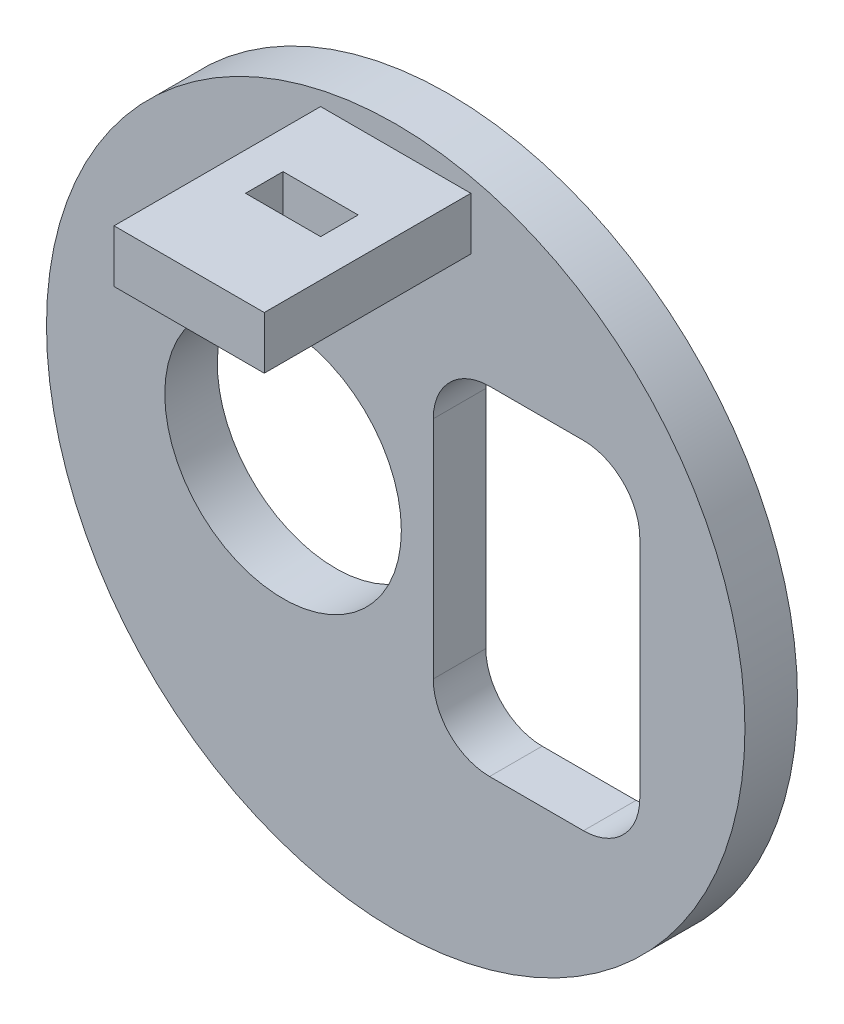
ISO-10303-21;
HEADER;
FILE_DESCRIPTION(('STEP AP214'),'2;1');
FILE_NAME('part.step','',(''),(''),'','','');
FILE_SCHEMA(('AUTOMOTIVE_DESIGN { 1 0 10303 214 1 1 1 1 }'));
ENDSEC;
DATA;
#1=APPLICATION_CONTEXT('core data for automotive mechanical design processes');
#2=APPLICATION_PROTOCOL_DEFINITION('international standard','automotive_design',2000,#1);
#3=PRODUCT_CONTEXT('',#1,'mechanical');
#4=PRODUCT('Part','Part','',(#3));
#5=PRODUCT_RELATED_PRODUCT_CATEGORY('part','',(#4));
#6=PRODUCT_DEFINITION_FORMATION('','',#4);
#7=PRODUCT_DEFINITION_CONTEXT('part definition',#1,'design');
#8=PRODUCT_DEFINITION('design','',#6,#7);
#9=PRODUCT_DEFINITION_SHAPE('','',#8);
#10=(LENGTH_UNIT() NAMED_UNIT(*) SI_UNIT(.MILLI.,.METRE.));
#11=(NAMED_UNIT(*) PLANE_ANGLE_UNIT() SI_UNIT($,.RADIAN.));
#12=(NAMED_UNIT(*) SI_UNIT($,.STERADIAN.) SOLID_ANGLE_UNIT());
#13=UNCERTAINTY_MEASURE_WITH_UNIT(LENGTH_MEASURE(1.E-05),#10,'distance_accuracy_value','');
#14=(GEOMETRIC_REPRESENTATION_CONTEXT(3) GLOBAL_UNCERTAINTY_ASSIGNED_CONTEXT((#13)) GLOBAL_UNIT_ASSIGNED_CONTEXT((#10,
#11,#12)) REPRESENTATION_CONTEXT('',''));
#15=CARTESIAN_POINT('',(0.,0.,0.));
#16=DIRECTION('',(0.,0.,1.));
#17=DIRECTION('',(1.,0.,0.));
#18=AXIS2_PLACEMENT_3D('',#15,#16,#17);
#19=CARTESIAN_POINT('',(48.,0.,64.6));
#20=DIRECTION('',(0.,0.,-1.));
#21=DIRECTION('',(-1.,0.,0.));
#22=AXIS2_PLACEMENT_3D('',#19,#20,#21);
#23=CYLINDRICAL_SURFACE('',#22,18.6);
#24=CARTESIAN_POINT('',(48.,0.,64.6));
#25=DIRECTION('',(0.,0.,1.));
#26=DIRECTION('',(1.,0.,0.));
#27=AXIS2_PLACEMENT_3D('',#24,#25,#26);
#28=CIRCLE('',#27,18.6);
#29=CARTESIAN_POINT('',(66.6,0.,64.6));
#30=VERTEX_POINT('',#29);
#31=EDGE_CURVE('E198',#30,#30,#28,.T.);
#32=ORIENTED_EDGE('',*,*,#31,.F.);
#33=EDGE_LOOP('',(#32));
#34=FACE_BOUND('',#33,.T.);
#35=CARTESIAN_POINT('',(48.,0.,61.8));
#36=DIRECTION('',(0.,0.,1.));
#37=DIRECTION('',(1.,0.,0.));
#38=AXIS2_PLACEMENT_3D('',#35,#36,#37);
#39=CIRCLE('',#38,18.6);
#40=CARTESIAN_POINT('',(66.6,0.,61.8));
#41=VERTEX_POINT('',#40);
#42=EDGE_CURVE('E289',#41,#41,#39,.T.);
#43=ORIENTED_EDGE('',*,*,#42,.T.);
#44=EDGE_LOOP('',(#43));
#45=FACE_BOUND('',#44,.T.);
#46=ADVANCED_FACE('F43',(#34,#45),#23,.T.);
#47=CARTESIAN_POINT('',(48.,0.,64.6));
#48=DIRECTION('',(0.,0.,1.));
#49=DIRECTION('',(1.,0.,0.));
#50=AXIS2_PLACEMENT_3D('',#47,#48,#49);
#51=PLANE('',#50);
#52=CARTESIAN_POINT('',(53.,-6.,64.6));
#53=DIRECTION('',(0.,0.,1.));
#54=DIRECTION('',(1.,0.,0.));
#55=AXIS2_PLACEMENT_3D('',#52,#53,#54);
#56=CIRCLE('',#55,3.);
#57=CARTESIAN_POINT('',(50.,-6.,64.6));
#58=VERTEX_POINT('',#57);
#59=CARTESIAN_POINT('',(53.,-9.,64.6));
#60=VERTEX_POINT('',#59);
#61=EDGE_CURVE('E294',#58,#60,#56,.T.);
#62=ORIENTED_EDGE('',*,*,#61,.F.);
#63=DIRECTION('',(0.,-1.,0.));
#64=VECTOR('',#63,1.);
#65=CARTESIAN_POINT('',(50.,0.,64.6));
#66=LINE('',#65,#64);
#67=CARTESIAN_POINT('',(50.,6.,64.6));
#68=VERTEX_POINT('',#67);
#69=EDGE_CURVE('E300',#68,#58,#66,.T.);
#70=ORIENTED_EDGE('',*,*,#69,.F.);
#71=CARTESIAN_POINT('',(53.,6.,64.6));
#72=DIRECTION('',(0.,0.,1.));
#73=DIRECTION('',(1.,0.,0.));
#74=AXIS2_PLACEMENT_3D('',#71,#72,#73);
#75=CIRCLE('',#74,3.);
#76=CARTESIAN_POINT('',(53.,9.,64.6));
#77=VERTEX_POINT('',#76);
#78=EDGE_CURVE('E305',#77,#68,#75,.T.);
#79=ORIENTED_EDGE('',*,*,#78,.F.);
#80=DIRECTION('',(-1.,0.,0.));
#81=VECTOR('',#80,1.);
#82=CARTESIAN_POINT('',(48.,9.,64.6));
#83=LINE('',#82,#81);
#84=CARTESIAN_POINT('',(58.,9.,64.6));
#85=VERTEX_POINT('',#84);
#86=EDGE_CURVE('E307',#85,#77,#83,.T.);
#87=ORIENTED_EDGE('',*,*,#86,.F.);
#88=CARTESIAN_POINT('',(58.,6.,64.6));
#89=DIRECTION('',(0.,0.,1.));
#90=DIRECTION('',(1.,0.,0.));
#91=AXIS2_PLACEMENT_3D('',#88,#89,#90);
#92=CIRCLE('',#91,3.);
#93=CARTESIAN_POINT('',(61.,6.,64.6));
#94=VERTEX_POINT('',#93);
#95=EDGE_CURVE('E310',#94,#85,#92,.T.);
#96=ORIENTED_EDGE('',*,*,#95,.F.);
#97=DIRECTION('',(0.,1.,0.));
#98=VECTOR('',#97,1.);
#99=CARTESIAN_POINT('',(61.,0.,64.6));
#100=LINE('',#99,#98);
#101=CARTESIAN_POINT('',(61.,-6.,64.6));
#102=VERTEX_POINT('',#101);
#103=EDGE_CURVE('E313',#102,#94,#100,.T.);
#104=ORIENTED_EDGE('',*,*,#103,.F.);
#105=CARTESIAN_POINT('',(58.,-6.,64.6));
#106=DIRECTION('',(0.,0.,1.));
#107=DIRECTION('',(1.,0.,0.));
#108=AXIS2_PLACEMENT_3D('',#105,#106,#107);
#109=CIRCLE('',#108,3.);
#110=CARTESIAN_POINT('',(58.,-9.,64.6));
#111=VERTEX_POINT('',#110);
#112=EDGE_CURVE('E311',#111,#102,#109,.T.);
#113=ORIENTED_EDGE('',*,*,#112,.F.);
#114=DIRECTION('',(1.,0.,0.));
#115=VECTOR('',#114,1.);
#116=CARTESIAN_POINT('',(48.,-9.,64.6));
#117=LINE('',#116,#115);
#118=EDGE_CURVE('E312',#60,#111,#117,.T.);
#119=ORIENTED_EDGE('',*,*,#118,.F.);
#120=EDGE_LOOP('',(#62,#70,#79,#87,#96,#104,#113,#119));
#121=FACE_BOUND('',#120,.T.);
#122=CARTESIAN_POINT('',(42.,0.,64.6));
#123=DIRECTION('',(0.,0.,1.));
#124=DIRECTION('',(1.,0.,0.));
#125=AXIS2_PLACEMENT_3D('',#122,#123,#124);
#126=CIRCLE('',#125,6.3);
#127=CARTESIAN_POINT('',(48.3,0.,64.6));
#128=VERTEX_POINT('',#127);
#129=EDGE_CURVE('E268',#128,#128,#126,.T.);
#130=ORIENTED_EDGE('',*,*,#129,.F.);
#131=EDGE_LOOP('',(#130));
#132=FACE_BOUND('',#131,.T.);
#133=DIRECTION('',(0.,-1.,0.));
#134=VECTOR('',#133,1.);
#135=CARTESIAN_POINT('',(44.,17.4,64.6));
#136=LINE('',#135,#134);
#137=CARTESIAN_POINT('',(44.,17.4,64.6));
#138=VERTEX_POINT('',#137);
#139=CARTESIAN_POINT('',(44.,14.6,64.6));
#140=VERTEX_POINT('',#139);
#141=EDGE_CURVE('E262',#138,#140,#136,.T.);
#142=ORIENTED_EDGE('',*,*,#141,.F.);
#143=DIRECTION('',(-1.,0.,0.));
#144=VECTOR('',#143,1.);
#145=CARTESIAN_POINT('',(52.,17.4,64.6));
#146=LINE('',#145,#144);
#147=CARTESIAN_POINT('',(52.,17.4,64.6));
#148=VERTEX_POINT('',#147);
#149=EDGE_CURVE('E260',#148,#138,#146,.T.);
#150=ORIENTED_EDGE('',*,*,#149,.F.);
#151=DIRECTION('',(0.,1.,0.));
#152=VECTOR('',#151,1.);
#153=CARTESIAN_POINT('',(52.,14.6,64.6));
#154=LINE('',#153,#152);
#155=CARTESIAN_POINT('',(52.,14.6,64.6));
#156=VERTEX_POINT('',#155);
#157=EDGE_CURVE('E271',#156,#148,#154,.T.);
#158=ORIENTED_EDGE('',*,*,#157,.F.);
#159=DIRECTION('',(1.,0.,0.));
#160=VECTOR('',#159,1.);
#161=CARTESIAN_POINT('',(44.,14.6,64.6));
#162=LINE('',#161,#160);
#163=EDGE_CURVE('E270',#140,#156,#162,.T.);
#164=ORIENTED_EDGE('',*,*,#163,.F.);
#165=EDGE_LOOP('',(#142,#150,#158,#164));
#166=FACE_BOUND('',#165,.T.);
#167=ORIENTED_EDGE('',*,*,#31,.T.);
#168=EDGE_LOOP('',(#167));
#169=FACE_BOUND('',#168,.T.);
#170=ADVANCED_FACE('F215',(#121,#132,#166,#169),#51,.T.);
#171=CARTESIAN_POINT('',(48.,0.,61.8));
#172=DIRECTION('',(0.,0.,1.));
#173=DIRECTION('',(1.,0.,0.));
#174=AXIS2_PLACEMENT_3D('',#171,#172,#173);
#175=PLANE('',#174);
#176=DIRECTION('',(0.,-1.,0.));
#177=VECTOR('',#176,1.);
#178=CARTESIAN_POINT('',(50.,0.,61.8));
#179=LINE('',#178,#177);
#180=CARTESIAN_POINT('',(50.,6.,61.8));
#181=VERTEX_POINT('',#180);
#182=CARTESIAN_POINT('',(50.,-6.,61.8));
#183=VERTEX_POINT('',#182);
#184=EDGE_CURVE('E173',#181,#183,#179,.T.);
#185=ORIENTED_EDGE('',*,*,#184,.T.);
#186=CARTESIAN_POINT('',(53.,-6.,61.8));
#187=DIRECTION('',(0.,0.,1.));
#188=DIRECTION('',(1.,0.,0.));
#189=AXIS2_PLACEMENT_3D('',#186,#187,#188);
#190=CIRCLE('',#189,3.);
#191=CARTESIAN_POINT('',(53.,-9.,61.8));
#192=VERTEX_POINT('',#191);
#193=EDGE_CURVE('E160',#183,#192,#190,.T.);
#194=ORIENTED_EDGE('',*,*,#193,.T.);
#195=DIRECTION('',(1.,0.,0.));
#196=VECTOR('',#195,1.);
#197=CARTESIAN_POINT('',(48.,-9.,61.8));
#198=LINE('',#197,#196);
#199=CARTESIAN_POINT('',(58.,-9.,61.8));
#200=VERTEX_POINT('',#199);
#201=EDGE_CURVE('E195',#192,#200,#198,.T.);
#202=ORIENTED_EDGE('',*,*,#201,.T.);
#203=CARTESIAN_POINT('',(58.,-6.,61.8));
#204=DIRECTION('',(0.,0.,1.));
#205=DIRECTION('',(1.,0.,0.));
#206=AXIS2_PLACEMENT_3D('',#203,#204,#205);
#207=CIRCLE('',#206,3.);
#208=CARTESIAN_POINT('',(61.,-6.,61.8));
#209=VERTEX_POINT('',#208);
#210=EDGE_CURVE('E188',#200,#209,#207,.T.);
#211=ORIENTED_EDGE('',*,*,#210,.T.);
#212=DIRECTION('',(0.,1.,0.));
#213=VECTOR('',#212,1.);
#214=CARTESIAN_POINT('',(61.,0.,61.8));
#215=LINE('',#214,#213);
#216=CARTESIAN_POINT('',(61.,6.,61.8));
#217=VERTEX_POINT('',#216);
#218=EDGE_CURVE('E190',#209,#217,#215,.T.);
#219=ORIENTED_EDGE('',*,*,#218,.T.);
#220=CARTESIAN_POINT('',(58.,6.,61.8));
#221=DIRECTION('',(0.,0.,1.));
#222=DIRECTION('',(1.,0.,0.));
#223=AXIS2_PLACEMENT_3D('',#220,#221,#222);
#224=CIRCLE('',#223,3.);
#225=CARTESIAN_POINT('',(58.,9.,61.8));
#226=VERTEX_POINT('',#225);
#227=EDGE_CURVE('E184',#217,#226,#224,.T.);
#228=ORIENTED_EDGE('',*,*,#227,.T.);
#229=DIRECTION('',(-1.,0.,0.));
#230=VECTOR('',#229,1.);
#231=CARTESIAN_POINT('',(48.,9.,61.8));
#232=LINE('',#231,#230);
#233=CARTESIAN_POINT('',(53.,9.,61.8));
#234=VERTEX_POINT('',#233);
#235=EDGE_CURVE('E182',#226,#234,#232,.T.);
#236=ORIENTED_EDGE('',*,*,#235,.T.);
#237=CARTESIAN_POINT('',(53.,6.,61.8));
#238=DIRECTION('',(0.,0.,1.));
#239=DIRECTION('',(1.,0.,0.));
#240=AXIS2_PLACEMENT_3D('',#237,#238,#239);
#241=CIRCLE('',#240,3.);
#242=EDGE_CURVE('E180',#234,#181,#241,.T.);
#243=ORIENTED_EDGE('',*,*,#242,.T.);
#244=EDGE_LOOP('',(#185,#194,#202,#211,#219,#228,#236,#243));
#245=FACE_BOUND('',#244,.T.);
#246=CARTESIAN_POINT('',(48.3,0.,61.8));
#247=CARTESIAN_POINT('',(48.3000080200575,0.103949671619081,61.8));
#248=CARTESIAN_POINT('',(48.2975244357872,0.207904697156739,61.8));
#249=CARTESIAN_POINT('',(48.2875253380658,0.414824115879898,61.8));
#250=CARTESIAN_POINT('',(48.2800460464727,0.517790266180227,61.8));
#251=CARTESIAN_POINT('',(48.2600574518887,0.722733265238126,61.8));
#252=CARTESIAN_POINT('',(48.247572606749,0.824712490246746,61.8));
#253=CARTESIAN_POINT('',(48.2175875745373,1.02768040978872,61.8));
#254=CARTESIAN_POINT('',(48.2000995331272,1.12867089783499,61.8));
#255=CARTESIAN_POINT('',(48.1601199064886,1.32966235629979,61.8));
#256=CARTESIAN_POINT('',(48.1376280490243,1.42966327257075,61.8));
#257=CARTESIAN_POINT('',(48.0876536019993,1.62867761359245,61.8));
#258=CARTESIAN_POINT('',(48.0601585718764,1.72768791275454,61.8));
#259=CARTESIAN_POINT('',(48.0001893386605,1.92472432401122,61.8));
#260=CARTESIAN_POINT('',(47.9676911278537,2.02274312397408,61.8));
#261=CARTESIAN_POINT('',(47.8977288516574,2.21780093971258,61.8));
#262=CARTESIAN_POINT('',(47.8602301442489,2.31482751347263,61.8));
#263=CARTESIAN_POINT('',(47.7806737839579,2.50693104937072,61.8));
#264=CARTESIAN_POINT('',(47.7386186422738,2.60200905141365,61.8));
#265=CARTESIAN_POINT('',(47.6502254343453,2.78932755387306,61.8));
#266=CARTESIAN_POINT('',(47.6039200214132,2.88158344555947,61.8));
#267=CARTESIAN_POINT('',(47.5070393172947,3.06326064959696,61.8));
#268=CARTESIAN_POINT('',(47.4564854811934,3.15269339797635,61.8));
#269=CARTESIAN_POINT('',(47.3511188530655,3.32872856502539,61.8));
#270=CARTESIAN_POINT('',(47.2963163688645,3.4153371518457,61.8));
#271=CARTESIAN_POINT('',(47.1824637861314,3.5857295263083,61.8));
#272=CARTESIAN_POINT('',(47.1234132260276,3.66951300553349,61.8));
#273=CARTESIAN_POINT('',(47.0010753503131,3.83426195643825,61.8));
#274=CARTESIAN_POINT('',(46.9377775103893,3.91521961108015,61.8));
#275=CARTESIAN_POINT('',(46.8069544731276,4.0743243395549,61.8));
#276=CARTESIAN_POINT('',(46.7394096765113,4.15245529126012,61.8));
#277=CARTESIAN_POINT('',(46.6001035782151,4.30591604041611,61.8));
#278=CARTESIAN_POINT('',(46.5283148318068,4.38122090298188,61.8));
#279=CARTESIAN_POINT('',(46.3812849939921,4.52827014994126,61.8));
#280=CARTESIAN_POINT('',(46.3060464947787,4.60001712605492,61.8));
#281=CARTESIAN_POINT('',(46.1526982490034,4.73925035793968,61.8));
#282=CARTESIAN_POINT('',(46.0746127816431,4.80676333073416,61.8));
#283=CARTESIAN_POINT('',(45.9155817948145,4.93753650943269,61.8));
#284=CARTESIAN_POINT('',(45.8346517206224,5.00081549109494,61.8));
#285=CARTESIAN_POINT('',(45.669939915856,5.12312872436054,61.8));
#286=CARTESIAN_POINT('',(45.5861653480557,5.18217261926017,61.8));
#287=CARTESIAN_POINT('',(45.4157729362113,5.29602514714695,61.8));
#288=CARTESIAN_POINT('',(45.329154783757,5.35083331855841,61.8));
#289=CARTESIAN_POINT('',(45.153082630921,5.45622482471483,61.8));
#290=CARTESIAN_POINT('',(45.0636218987899,5.50679690997571,61.8));
#291=CARTESIAN_POINT('',(44.8818704285238,5.60372670304581,61.8));
#292=CARTESIAN_POINT('',(44.7895677526893,5.65006201563356,61.8));
#293=CARTESIAN_POINT('',(44.6021388135435,5.73853112502086,61.8));
#294=CARTESIAN_POINT('',(44.5069967367762,5.78063138234708,61.8));
#295=CARTESIAN_POINT('',(44.3148855683865,5.86022128887732,61.8));
#296=CARTESIAN_POINT('',(44.2179178798298,5.8977143245077,61.8));
#297=CARTESIAN_POINT('',(44.0229603231377,5.96766522465422,61.8));
#298=CARTESIAN_POINT('',(43.9249826618978,6.00015706372969,61.8));
#299=CARTESIAN_POINT('',(43.7280124592454,6.06011720303799,61.8));
#300=CARTESIAN_POINT('',(43.629027002236,6.08760876046084,61.8));
#301=CARTESIAN_POINT('',(43.4300458891198,6.13757897443141,61.8));
#302=CARTESIAN_POINT('',(43.3300531602237,6.16006928129813,61.8));
#303=CARTESIAN_POINT('',(43.1290616222702,6.20004894852376,61.8));
#304=CARTESIAN_POINT('',(43.0280627049163,6.21753776441886,61.8));
#305=CARTESIAN_POINT('',(42.8250616633478,6.24752692406607,61.8));
#306=CARTESIAN_POINT('',(42.7230576247988,6.26001429852114,61.8));
#307=CARTESIAN_POINT('',(42.5180477355056,6.28001247395027,61.8));
#308=CARTESIAN_POINT('',(42.4150394260452,6.28749801607772,61.8));
#309=CARTESIAN_POINT('',(42.2080220029294,6.29750686574316,61.8));
#310=CARTESIAN_POINT('',(42.1040111145463,6.29999313530056,61.8));
#311=CARTESIAN_POINT('',(41.8960657994917,6.30000685962313,61.8));
#312=CARTESIAN_POINT('',(41.7921313731546,6.29753797996828,61.8));
#313=CARTESIAN_POINT('',(41.5852450262536,6.28755715793385,61.8));
#314=CARTESIAN_POINT('',(41.4822913818896,6.28008127533087,61.8));
#315=CARTESIAN_POINT('',(41.2773688912291,6.26009998757959,61.8));
#316=CARTESIAN_POINT('',(41.1753976899262,6.24761878035677,61.8));
#317=CARTESIAN_POINT('',(40.9724403391637,6.21763846293624,61.8));
#318=CARTESIAN_POINT('',(40.87145243571,6.20015123642476,61.8));
#319=CARTESIAN_POINT('',(40.670460911308,6.16017150107074,61.8));
#320=CARTESIAN_POINT('',(40.5704573986643,6.13767844776597,61.8));
#321=CARTESIAN_POINT('',(40.371432536733,6.08769968320015,61.8));
#322=CARTESIAN_POINT('',(40.2724143819663,6.06020125728702,61.8));
#323=CARTESIAN_POINT('',(40.0753569708714,6.00022327415012,61.8));
#324=CARTESIAN_POINT('',(39.9773251091278,5.96771943988504,61.8));
#325=CARTESIAN_POINT('',(39.7822357280935,5.89774427319772,61.8));
#326=CARTESIAN_POINT('',(39.6851907429898,5.86023804298441,61.8));
#327=CARTESIAN_POINT('',(39.4930690704587,5.78067349569623,61.8));
#328=CARTESIAN_POINT('',(39.3979909805835,5.73861856530366,61.8));
#329=CARTESIAN_POINT('',(39.2106724143605,5.65022551076753,61.8));
#330=CARTESIAN_POINT('',(39.1184165459499,5.60392004184369,61.8));
#331=CARTESIAN_POINT('',(38.9367393588578,5.50703929696271,61.8));
#332=CARTESIAN_POINT('',(38.8473066042887,5.4564854757517,61.8));
#333=CARTESIAN_POINT('',(38.6712714327207,5.35111885849537,61.8));
#334=CARTESIAN_POINT('',(38.5846628475526,5.29631637032003,61.8));
#335=CARTESIAN_POINT('',(38.4142704742998,5.18246378467681,61.8));
#336=CARTESIAN_POINT('',(38.3304869946319,5.12341322563772,61.8));
#337=CARTESIAN_POINT('',(38.1657380434018,5.0010753507051,61.8));
#338=CARTESIAN_POINT('',(38.0847803888788,4.93777751049495,61.8));
#339=CARTESIAN_POINT('',(37.9256756604911,4.80695447302228,61.8));
#340=CARTESIAN_POINT('',(37.8475447087535,4.73940967648319,61.8));
#341=CARTESIAN_POINT('',(37.6940839595729,4.60010357824391,61.8));
#342=CARTESIAN_POINT('',(37.6187790970154,4.52831483181452,61.8));
#343=CARTESIAN_POINT('',(37.471729850062,4.38128499398494,61.8));
#344=CARTESIAN_POINT('',(37.3999828739461,4.30604649477765,61.8));
#345=CARTESIAN_POINT('',(37.2607496420598,4.15269824900724,61.8));
#346=CARTESIAN_POINT('',(37.1932366692661,4.07461278164584,61.8));
#347=CARTESIAN_POINT('',(37.0624634905681,3.91558179481671,61.8));
#348=CARTESIAN_POINT('',(36.9991845089057,3.8346517206252,61.8));
#349=CARTESIAN_POINT('',(36.8768712756401,3.66993991585936,61.8));
#350=CARTESIAN_POINT('',(36.8178273807405,3.58616534805902,61.8));
#351=CARTESIAN_POINT('',(36.7039748528538,3.41577293621453,61.8));
#352=CARTESIAN_POINT('',(36.6491666814423,3.32915478376021,61.8));
#353=CARTESIAN_POINT('',(36.5437751752858,3.15308263092389,61.8));
#354=CARTESIAN_POINT('',(36.4932030900249,3.06362189879255,61.8));
#355=CARTESIAN_POINT('',(36.3962732969546,2.88187042852596,61.8));
#356=CARTESIAN_POINT('',(36.3499379843668,2.7895677526911,61.8));
#357=CARTESIAN_POINT('',(36.2614688749793,2.60213881354449,61.8));
#358=CARTESIAN_POINT('',(36.219368617653,2.50699673677667,61.8));
#359=CARTESIAN_POINT('',(36.1397787111228,2.31488556838643,61.8));
#360=CARTESIAN_POINT('',(36.1022856754925,2.21791787982966,61.8));
#361=CARTESIAN_POINT('',(36.0323347753461,2.02296032313757,61.8));
#362=CARTESIAN_POINT('',(35.9998429362706,1.92498266189759,61.8));
#363=CARTESIAN_POINT('',(35.9398827969624,1.72801245924516,61.8));
#364=CARTESIAN_POINT('',(35.9123912395396,1.62902700223569,61.8));
#365=CARTESIAN_POINT('',(35.8624210255691,1.43004588911951,61.8));
#366=CARTESIAN_POINT('',(35.8399307187024,1.33005316022337,61.8));
#367=CARTESIAN_POINT('',(35.7999510514768,1.12906162226986,61.8));
#368=CARTESIAN_POINT('',(35.7824622355817,1.02806270491604,61.8));
#369=CARTESIAN_POINT('',(35.7524730759344,0.825061663347533,61.8));
#370=CARTESIAN_POINT('',(35.7399857014793,0.72305762479859,61.8));
#371=CARTESIAN_POINT('',(35.7199875260501,0.518047735505411,61.8));
#372=CARTESIAN_POINT('',(35.7125019839226,0.415039426045054,61.8));
#373=CARTESIAN_POINT('',(35.702493134257,0.208022002929275,61.8));
#374=CARTESIAN_POINT('',(35.7000068646995,0.104011114546215,61.8));
#375=CARTESIAN_POINT('',(35.6999931403768,-0.10393420050827,61.8));
#376=CARTESIAN_POINT('',(35.7024620200316,-0.207868626845334,61.8));
#377=CARTESIAN_POINT('',(35.7124428420659,-0.414754973746165,61.8));
#378=CARTESIAN_POINT('',(35.7199187246688,-0.517708618110161,61.8));
#379=CARTESIAN_POINT('',(35.73990001242,-0.722631108770598,61.8));
#380=CARTESIAN_POINT('',(35.7523812196428,-0.824602310073436,61.8));
#381=CARTESIAN_POINT('',(35.7823615370633,-1.0275596608359,61.8));
#382=CARTESIAN_POINT('',(35.7998487635747,-1.12854756428965,61.8));
#383=CARTESIAN_POINT('',(35.8398284989287,-1.32953908869158,61.8));
#384=CARTESIAN_POINT('',(35.8623215522335,-1.42954260133536,61.8));
#385=CARTESIAN_POINT('',(35.9123003167994,-1.62856746326668,61.8));
#386=CARTESIAN_POINT('',(35.9397987427126,-1.72758561803336,61.8));
#387=CARTESIAN_POINT('',(35.9997767258495,-1.92464302912831,61.8));
#388=CARTESIAN_POINT('',(36.0322805601147,-2.02267489087198,61.8));
#389=CARTESIAN_POINT('',(36.1022557268021,-2.21776427190637,61.8));
#390=CARTESIAN_POINT('',(36.1397619570155,-2.3148092570101,61.8));
#391=CARTESIAN_POINT('',(36.2193265043039,-2.50693092954148,61.8));
#392=CARTESIAN_POINT('',(36.2613814346966,-2.60200901941696,61.8));
#393=CARTESIAN_POINT('',(36.349774489233,-2.78932758564033,61.8));
#394=CARTESIAN_POINT('',(36.3960799581569,-2.88158345405104,61.8));
#395=CARTESIAN_POINT('',(36.4929607030381,-3.06326064114346,61.8));
#396=CARTESIAN_POINT('',(36.5435145242492,-3.15269339571256,61.8));
#397=CARTESIAN_POINT('',(36.6488811415056,-3.32872856728069,61.8));
#398=CARTESIAN_POINT('',(36.7036836296809,-3.41533715244885,61.8));
#399=CARTESIAN_POINT('',(36.8175362153241,-3.58572952570171,61.8));
#400=CARTESIAN_POINT('',(36.8765867743632,-3.66951300536952,61.8));
#401=CARTESIAN_POINT('',(36.9989246492958,-3.83426195659947,61.8));
#402=CARTESIAN_POINT('',(37.0622224895058,-3.91521961112245,61.8));
#403=CARTESIAN_POINT('',(37.1930455269783,-4.07432433950984,61.8));
#404=CARTESIAN_POINT('',(37.2605903235173,-4.15245529124736,61.8));
#405=CARTESIAN_POINT('',(37.3998964217564,-4.30591604042749,61.8));
#406=CARTESIAN_POINT('',(37.4716851681856,-4.38122090298481,61.8));
#407=CARTESIAN_POINT('',(37.6187150060153,-4.52827014993812,61.8));
#408=CARTESIAN_POINT('',(37.6939535052228,-4.60001712605417,61.8));
#409=CARTESIAN_POINT('',(37.8473017509936,-4.73925035794071,61.8));
#410=CARTESIAN_POINT('',(37.9253872183552,-4.8067633307346,61.8));
#411=CARTESIAN_POINT('',(38.0844182051846,-4.93753650943274,61.8));
#412=CARTESIAN_POINT('',(38.1653482793762,-5.00081549109517,61.8));
#413=CARTESIAN_POINT('',(38.3300600841421,-5.12312872436091,61.8));
#414=CARTESIAN_POINT('',(38.4138346519425,-5.1821726192605,61.8));
#415=CARTESIAN_POINT('',(38.584227063787,-5.29602514714725,61.8));
#416=CARTESIAN_POINT('',(38.6708452162413,-5.35083331855872,61.8));
#417=CARTESIAN_POINT('',(38.8469173690775,-5.45622482471512,61.8));
#418=CARTESIAN_POINT('',(38.9363781012087,-5.50679690997598,61.8));
#419=CARTESIAN_POINT('',(39.118129571475,-5.60372670304603,61.8));
#420=CARTESIAN_POINT('',(39.2104322473097,-5.65006201563375,61.8));
#421=CARTESIAN_POINT('',(39.397861186456,-5.73853112502097,61.8));
#422=CARTESIAN_POINT('',(39.4930032632236,-5.78063138234713,61.8));
#423=CARTESIAN_POINT('',(39.6851144316139,-5.86022128887731,61.8));
#424=CARTESIAN_POINT('',(39.782082120171,-5.89771432450769,61.8));
#425=CARTESIAN_POINT('',(39.9770396768636,-5.9676652246542,61.8));
#426=CARTESIAN_POINT('',(40.0750173381038,-6.00015706372968,61.8));
#427=CARTESIAN_POINT('',(40.2719875407566,-6.06011720303798,61.8));
#428=CARTESIAN_POINT('',(40.3709729977662,-6.08760876046083,61.8));
#429=CARTESIAN_POINT('',(40.5699541108826,-6.1375789744314,61.8));
#430=CARTESIAN_POINT('',(40.6699468397788,-6.16006928129812,61.8));
#431=CARTESIAN_POINT('',(40.8709383777323,-6.20004894852374,61.8));
#432=CARTESIAN_POINT('',(40.9719372950861,-6.21753776441885,61.8));
#433=CARTESIAN_POINT('',(41.1749383366544,-6.24752692406606,61.8));
#434=CARTESIAN_POINT('',(41.2769423752032,-6.26001429852114,61.8));
#435=CARTESIAN_POINT('',(41.481952264496,-6.28001247395026,61.8));
#436=CARTESIAN_POINT('',(41.5849605739561,-6.28749801607772,61.8));
#437=CARTESIAN_POINT('',(41.7919779970714,-6.29750686574316,61.8));
#438=CARTESIAN_POINT('',(41.8959888854541,-6.29999313530055,61.8));
#439=CARTESIAN_POINT('',(42.1039342005085,-6.30000685962314,61.8));
#440=CARTESIAN_POINT('',(42.2078686268458,-6.29753797996829,61.8));
#441=CARTESIAN_POINT('',(42.4147549737471,-6.28755715793385,61.8));
#442=CARTESIAN_POINT('',(42.5177086181112,-6.28008127533087,61.8));
#443=CARTESIAN_POINT('',(42.7226311087719,-6.26009998757959,61.8));
#444=CARTESIAN_POINT('',(42.8246023100749,-6.24761878035678,61.8));
#445=CARTESIAN_POINT('',(43.0275596608375,-6.21763846293624,61.8));
#446=CARTESIAN_POINT('',(43.1285475642912,-6.20015123642477,61.8));
#447=CARTESIAN_POINT('',(43.3295390886932,-6.16017150107075,61.8));
#448=CARTESIAN_POINT('',(43.4295426013369,-6.13767844776598,61.8));
#449=CARTESIAN_POINT('',(43.6285674632681,-6.08769968320016,61.8));
#450=CARTESIAN_POINT('',(43.7275856180347,-6.06020125728702,61.8));
#451=CARTESIAN_POINT('',(43.9246430291294,-6.00022327415013,61.8));
#452=CARTESIAN_POINT('',(44.0226748908729,-5.96771943988505,61.8));
#453=CARTESIAN_POINT('',(44.2177642719069,-5.89774427319772,61.8));
#454=CARTESIAN_POINT('',(44.3148092570103,-5.8602380429844,61.8));
#455=CARTESIAN_POINT('',(44.5069309295419,-5.7806734956959,61.8));
#456=CARTESIAN_POINT('',(44.6020090194178,-5.73861856530298,61.8));
#457=CARTESIAN_POINT('',(44.7893275856419,-5.65022551076624,61.8));
#458=CARTESIAN_POINT('',(44.8815834540529,-5.60392004184218,61.8));
#459=CARTESIAN_POINT('',(45.0632606411458,-5.50703929696081,61.8));
#460=CARTESIAN_POINT('',(45.1526933957151,-5.45648547574966,61.8));
#461=CARTESIAN_POINT('',(45.3287285672835,-5.35111885849312,61.8));
#462=CARTESIAN_POINT('',(45.4153371524517,-5.29631637031772,61.8));
#463=CARTESIAN_POINT('',(45.5857295257046,-5.18246378467454,61.8));
#464=CARTESIAN_POINT('',(45.6695130053725,-5.12341322563554,61.8));
#465=CARTESIAN_POINT('',(45.8342619566019,-5.00107535070299,61.8));
#466=CARTESIAN_POINT('',(45.9152196111243,-4.93777751049283,61.8));
#467=CARTESIAN_POINT('',(46.0743243395123,-4.80695447302101,61.8));
#468=CARTESIAN_POINT('',(46.152455291251,-4.73940967648278,61.8));
#469=CARTESIAN_POINT('',(46.3059160404263,-4.60010357824238,61.8));
#470=CARTESIAN_POINT('',(46.3812209029776,-4.52831483181098,61.8));
#471=CARTESIAN_POINT('',(46.5282701499455,-4.38128499398796,61.8));
#472=CARTESIAN_POINT('',(46.6000171260822,-4.30604649478922,61.8));
#473=CARTESIAN_POINT('',(46.7392503579112,-4.15269824899474,61.8));
#474=CARTESIAN_POINT('',(46.8067633306277,-4.07461278160101,61.8));
#475=CARTESIAN_POINT('',(46.9375365095363,-3.9155817948596,61.8));
#476=CARTESIAN_POINT('',(47.0008154914848,-3.83465172078741,61.8));
#477=CARTESIAN_POINT('',(47.1231287239686,-3.66993991569539,61.8));
#478=CARTESIAN_POINT('',(47.1821726178032,-3.58616534745088,61.8));
#479=CARTESIAN_POINT('',(47.2960251486008,-3.41577293682045,61.8));
#480=CARTESIAN_POINT('',(47.3508333239886,-3.3291547860246,61.8));
#481=CARTESIAN_POINT('',(47.4562248192676,-3.15308262865153,61.8));
#482=CARTESIAN_POINT('',(47.5067968896261,-3.06362189030471,61.8));
#483=CARTESIAN_POINT('',(47.603726723495,-2.88187043705464,61.8));
#484=CARTESIAN_POINT('',(47.6500620921382,-2.78956778459952,61.8));
#485=CARTESIAN_POINT('',(47.7385310479501,-2.60213878139955,61.8));
#486=CARTESIAN_POINT('',(47.7806310936813,-2.50699661637935,61.8));
#487=CARTESIAN_POINT('',(47.860229193436,-2.31486730537528,61.8));
#488=CARTESIAN_POINT('',(47.8977297574712,-2.21788119933897,61.8));
#489=CARTESIAN_POINT('',(47.96769356216,-2.02289206453542,61.8));
#490=CARTESIAN_POINT('',(48.0001910337918,-1.92490133512631,61.8));
#491=CARTESIAN_POINT('',(48.0601599186713,-1.72791012949263,61.8));
#492=CARTESIAN_POINT('',(48.0876548588395,-1.62891682017645,61.8));
#493=CARTESIAN_POINT('',(48.1376294374052,-1.42992516535725,61.8));
#494=CARTESIAN_POINT('',(48.1601210002214,-1.32992981611514,61.8));
#495=CARTESIAN_POINT('',(48.2001006145454,-1.12893827503143,61.8));
#496=CARTESIAN_POINT('',(48.2175883938105,-1.02794202904289,61.8));
#497=CARTESIAN_POINT('',(48.2475734389295,-0.82495132523126,61.8));
#498=CARTESIAN_POINT('',(48.2600579998197,-0.722954991566155,61.8));
#499=CARTESIAN_POINT('',(48.2800465965129,-0.517966499021581,61.8));
#500=CARTESIAN_POINT('',(48.28752561387,-0.414971910147029,61.8));
#501=CARTESIAN_POINT('',(48.2975246998599,-0.207984255959935,61.8));
#502=CARTESIAN_POINT('',(48.3000079992416,-0.103989407450657,61.8));
#503=CARTESIAN_POINT('',(48.3,0.,61.8));
#504=B_SPLINE_CURVE_WITH_KNOTS('',3,(#246,#247,#248,#249,#250,#251,#252,#253,#254,#255,#256,
#257,#258,#259,#260,#261,#262,#263,#264,#265,#266,#267,#268,#269,#270,#271,#272,#273,#274,#275,
#276,#277,#278,#279,#280,#281,#282,#283,#284,#285,#286,#287,#288,#289,#290,#291,#292,#293,#294,
#295,#296,#297,#298,#299,#300,#301,#302,#303,#304,#305,#306,#307,#308,#309,#310,#311,#312,#313,
#314,#315,#316,#317,#318,#319,#320,#321,#322,#323,#324,#325,#326,#327,#328,#329,#330,#331,#332,
#333,#334,#335,#336,#337,#338,#339,#340,#341,#342,#343,#344,#345,#346,#347,#348,#349,#350,#351,
#352,#353,#354,#355,#356,#357,#358,#359,#360,#361,#362,#363,#364,#365,#366,#367,#368,#369,#370,
#371,#372,#373,#374,#375,#376,#377,#378,#379,#380,#381,#382,#383,#384,#385,#386,#387,#388,#389,
#390,#391,#392,#393,#394,#395,#396,#397,#398,#399,#400,#401,#402,#403,#404,#405,#406,#407,#408,
#409,#410,#411,#412,#413,#414,#415,#416,#417,#418,#419,#420,#421,#422,#423,#424,#425,#426,#427,
#428,#429,#430,#431,#432,#433,#434,#435,#436,#437,#438,#439,#440,#441,#442,#443,#444,#445,#446,
#447,#448,#449,#450,#451,#452,#453,#454,#455,#456,#457,#458,#459,#460,#461,#462,#463,#464,#465,
#466,#467,#468,#469,#470,#471,#472,#473,#474,#475,#476,#477,#478,#479,#480,#481,#482,#483,#484,
#485,#486,#487,#488,#489,#490,#491,#492,#493,#494,#495,#496,#497,#498,#499,#500,#501,#502,#503),
.UNSPECIFIED.,.F.,.F.,(4,2,2,2,2,2,2,2,2,2,2,2,2,2,2,2,2,2,2,2,2,2,2,2,2,2,2,2,2,2,2,2,2,2,2,2,
2,2,2,2,2,2,2,2,2,2,2,2,2,2,2,2,2,2,2,2,2,2,2,2,2,2,2,2,2,2,2,2,2,2,2,2,2,2,2,2,2,2,2,2,2,2,2,2,
2,2,2,2,2,2,2,2,2,2,2,2,2,2,2,2,2,2,2,2,2,2,2,2,2,2,2,2,2,2,2,2,2,2,2,2,2,2,2,2,2,2,2,2,4),(0.,
0.311826842429942,0.621416948153755,0.929512436754599,1.23686625446663,1.54423679804554,
1.8523823407517,2.1620554628518,2.47399768866393,2.78576885925222,3.09531849937106,
3.40338934204993,3.71073484151834,4.01811378598521,4.32628471661153,4.63600035552581,
4.94800224496965,5.25977341555908,5.56932305567876,5.87739389835815,6.18473939782675,
6.49211834229343,6.80028927291919,7.11000491183253,7.42200680127502,7.73377797186428,
8.04332761198384,8.35139845466314,8.6587439541317,8.96612289859842,9.27429382922429,
9.58400946813781,9.89601135758057,10.2077825281693,10.5173321682884,10.8254030109675,
11.132748510436,11.4401274549028,11.7482983855288,12.0580140244427,12.3700159138859,
12.6817870844728,12.9913367245907,13.299407567269,13.6067530667372,13.9141320112042,
14.2223029418311,14.5320185807463,14.8440204701913,15.1557916407795,15.4653412808982,
15.773412123577,16.0807576230454,16.3881365675123,16.6963074981387,17.006023137053,
17.318025026497,17.6297961970863,17.9393458372059,18.2474166798852,18.5547621793538,
18.8621411238205,19.1703120544463,19.4800276933598,19.7920295828024,20.1038007533909,
20.4133503935099,20.7214212361889,21.0287667356574,21.3361456801242,21.6443166107504,
21.9540322496644,22.2660341391078,22.5778053096955,22.8873549498139,23.1954257924926,
23.5027712919609,23.8101502364278,24.1183211670544,24.428036805969,24.7400386954132,
25.0518098660022,25.3613595061215,25.6694303488007,25.9767758482692,26.284154792736,
26.592325723362,26.9020413622758,27.2140432517189,27.5258144223092,27.8353640624295,
28.1434349051093,28.450780404578,28.7581593490445,29.0663302796699,29.3760459185827,
29.6880478080244,29.9998189786136,30.3093686187331,30.6174394614124,30.924784960881,
31.2321639053477,31.5403348359736,31.8500504748871,32.1620523643298,32.4738235349188,
32.7833731750383,33.0914440177175,33.398789517186,33.7061684616528,34.0143393922787,
34.3240550311923,34.6360569206353,34.9478280912235,35.2573777313424,35.5654485740212,
35.8727940734897,36.1801730179565,36.4883439485828,36.798059587497,37.1100614769406,
37.4218923371036,37.7314845122791,38.0395807535259,38.3469346573102,38.654305280228,
38.962451555323,39.2721267129276,39.5840729085776),.UNSPECIFIED.);
#505=CARTESIAN_POINT('',(48.3,0.,61.8));
#506=VERTEX_POINT('',#505);
#507=EDGE_CURVE('E295',#506,#506,#504,.T.);
#508=ORIENTED_EDGE('',*,*,#507,.T.);
#509=EDGE_LOOP('',(#508));
#510=FACE_BOUND('',#509,.T.);
#511=ORIENTED_EDGE('',*,*,#42,.F.);
#512=EDGE_LOOP('',(#511));
#513=FACE_BOUND('',#512,.T.);
#514=ADVANCED_FACE('F205',(#245,#510,#513),#175,.F.);
#515=CARTESIAN_POINT('',(44.,17.4,75.6));
#516=DIRECTION('',(1.,0.,0.));
#517=DIRECTION('',(0.,0.,-1.));
#518=AXIS2_PLACEMENT_3D('',#515,#516,#517);
#519=PLANE('',#518);
#520=ORIENTED_EDGE('',*,*,#141,.T.);
#521=DIRECTION('',(0.,0.,-1.));
#522=VECTOR('',#521,1.);
#523=CARTESIAN_POINT('',(44.,14.6,75.6));
#524=LINE('',#523,#522);
#525=CARTESIAN_POINT('',(44.,14.6,75.6));
#526=VERTEX_POINT('',#525);
#527=EDGE_CURVE('E281',#526,#140,#524,.T.);
#528=ORIENTED_EDGE('',*,*,#527,.F.);
#529=DIRECTION('',(0.,-1.,0.));
#530=VECTOR('',#529,1.);
#531=CARTESIAN_POINT('',(44.,17.4,75.6));
#532=LINE('',#531,#530);
#533=CARTESIAN_POINT('',(44.,17.4,75.6));
#534=VERTEX_POINT('',#533);
#535=EDGE_CURVE('E250',#534,#526,#532,.T.);
#536=ORIENTED_EDGE('',*,*,#535,.F.);
#537=DIRECTION('',(0.,0.,-1.));
#538=VECTOR('',#537,1.);
#539=CARTESIAN_POINT('',(44.,17.4,75.6));
#540=LINE('',#539,#538);
#541=EDGE_CURVE('E263',#534,#138,#540,.T.);
#542=ORIENTED_EDGE('',*,*,#541,.T.);
#543=EDGE_LOOP('',(#520,#528,#536,#542));
#544=FACE_BOUND('',#543,.T.);
#545=ADVANCED_FACE('F211',(#544),#519,.F.);
#546=CARTESIAN_POINT('',(44.,14.6,75.6));
#547=DIRECTION('',(0.,1.,0.));
#548=DIRECTION('',(0.,0.,1.));
#549=AXIS2_PLACEMENT_3D('',#546,#547,#548);
#550=PLANE('',#549);
#551=DIRECTION('',(-1.,0.,0.));
#552=VECTOR('',#551,1.);
#553=CARTESIAN_POINT('',(44.,14.6,68.6));
#554=LINE('',#553,#552);
#555=CARTESIAN_POINT('',(50.,14.6,68.6));
#556=VERTEX_POINT('',#555);
#557=CARTESIAN_POINT('',(46.,14.6,68.6));
#558=VERTEX_POINT('',#557);
#559=EDGE_CURVE('E344',#556,#558,#554,.T.);
#560=ORIENTED_EDGE('',*,*,#559,.T.);
#561=DIRECTION('',(0.,0.,1.));
#562=VECTOR('',#561,1.);
#563=CARTESIAN_POINT('',(46.,14.6,75.6));
#564=LINE('',#563,#562);
#565=CARTESIAN_POINT('',(46.,14.6,70.6));
#566=VERTEX_POINT('',#565);
#567=EDGE_CURVE('E321',#558,#566,#564,.T.);
#568=ORIENTED_EDGE('',*,*,#567,.T.);
#569=DIRECTION('',(1.,0.,0.));
#570=VECTOR('',#569,1.);
#571=CARTESIAN_POINT('',(44.,14.6,70.6));
#572=LINE('',#571,#570);
#573=CARTESIAN_POINT('',(50.,14.6,70.6));
#574=VERTEX_POINT('',#573);
#575=EDGE_CURVE('E347',#566,#574,#572,.T.);
#576=ORIENTED_EDGE('',*,*,#575,.T.);
#577=DIRECTION('',(0.,0.,-1.));
#578=VECTOR('',#577,1.);
#579=CARTESIAN_POINT('',(50.,14.6,75.6));
#580=LINE('',#579,#578);
#581=EDGE_CURVE('E163',#574,#556,#580,.T.);
#582=ORIENTED_EDGE('',*,*,#581,.T.);
#583=EDGE_LOOP('',(#560,#568,#576,#582));
#584=FACE_BOUND('',#583,.T.);
#585=ORIENTED_EDGE('',*,*,#163,.T.);
#586=DIRECTION('',(0.,0.,-1.));
#587=VECTOR('',#586,1.);
#588=CARTESIAN_POINT('',(52.,14.6,75.6));
#589=LINE('',#588,#587);
#590=CARTESIAN_POINT('',(52.,14.6,75.6));
#591=VERTEX_POINT('',#590);
#592=EDGE_CURVE('E282',#591,#156,#589,.T.);
#593=ORIENTED_EDGE('',*,*,#592,.F.);
#594=DIRECTION('',(1.,0.,0.));
#595=VECTOR('',#594,1.);
#596=CARTESIAN_POINT('',(44.,14.6,75.6));
#597=LINE('',#596,#595);
#598=EDGE_CURVE('E258',#526,#591,#597,.T.);
#599=ORIENTED_EDGE('',*,*,#598,.F.);
#600=ORIENTED_EDGE('',*,*,#527,.T.);
#601=EDGE_LOOP('',(#585,#593,#599,#600));
#602=FACE_BOUND('',#601,.T.);
#603=ADVANCED_FACE('F218',(#584,#602),#550,.F.);
#604=CARTESIAN_POINT('',(52.,14.6,75.6));
#605=DIRECTION('',(-1.,0.,0.));
#606=DIRECTION('',(0.,0.,1.));
#607=AXIS2_PLACEMENT_3D('',#604,#605,#606);
#608=PLANE('',#607);
#609=ORIENTED_EDGE('',*,*,#157,.T.);
#610=DIRECTION('',(0.,0.,-1.));
#611=VECTOR('',#610,1.);
#612=CARTESIAN_POINT('',(52.,17.4,75.6));
#613=LINE('',#612,#611);
#614=CARTESIAN_POINT('',(52.,17.4,75.6));
#615=VERTEX_POINT('',#614);
#616=EDGE_CURVE('E279',#615,#148,#613,.T.);
#617=ORIENTED_EDGE('',*,*,#616,.F.);
#618=DIRECTION('',(0.,1.,0.));
#619=VECTOR('',#618,1.);
#620=CARTESIAN_POINT('',(52.,14.6,75.6));
#621=LINE('',#620,#619);
#622=EDGE_CURVE('E259',#591,#615,#621,.T.);
#623=ORIENTED_EDGE('',*,*,#622,.F.);
#624=ORIENTED_EDGE('',*,*,#592,.T.);
#625=EDGE_LOOP('',(#609,#617,#623,#624));
#626=FACE_BOUND('',#625,.T.);
#627=ADVANCED_FACE('F224',(#626),#608,.F.);
#628=CARTESIAN_POINT('',(52.,17.4,75.6));
#629=DIRECTION('',(0.,-1.,0.));
#630=DIRECTION('',(0.,0.,-1.));
#631=AXIS2_PLACEMENT_3D('',#628,#629,#630);
#632=PLANE('',#631);
#633=DIRECTION('',(-1.,0.,0.));
#634=VECTOR('',#633,1.);
#635=CARTESIAN_POINT('',(52.,17.4,70.6));
#636=LINE('',#635,#634);
#637=CARTESIAN_POINT('',(50.,17.4,70.6));
#638=VERTEX_POINT('',#637);
#639=CARTESIAN_POINT('',(46.,17.4,70.6));
#640=VERTEX_POINT('',#639);
#641=EDGE_CURVE('E155',#638,#640,#636,.T.);
#642=ORIENTED_EDGE('',*,*,#641,.T.);
#643=DIRECTION('',(0.,0.,-1.));
#644=VECTOR('',#643,1.);
#645=CARTESIAN_POINT('',(46.,17.4,75.6));
#646=LINE('',#645,#644);
#647=CARTESIAN_POINT('',(46.,17.4,68.6));
#648=VERTEX_POINT('',#647);
#649=EDGE_CURVE('E11',#640,#648,#646,.T.);
#650=ORIENTED_EDGE('',*,*,#649,.T.);
#651=DIRECTION('',(1.,0.,0.));
#652=VECTOR('',#651,1.);
#653=CARTESIAN_POINT('',(52.,17.4,68.6));
#654=LINE('',#653,#652);
#655=CARTESIAN_POINT('',(50.,17.4,68.6));
#656=VERTEX_POINT('',#655);
#657=EDGE_CURVE('E49',#648,#656,#654,.T.);
#658=ORIENTED_EDGE('',*,*,#657,.T.);
#659=DIRECTION('',(0.,0.,1.));
#660=VECTOR('',#659,1.);
#661=CARTESIAN_POINT('',(50.,17.4,75.6));
#662=LINE('',#661,#660);
#663=EDGE_CURVE('E156',#656,#638,#662,.T.);
#664=ORIENTED_EDGE('',*,*,#663,.T.);
#665=EDGE_LOOP('',(#642,#650,#658,#664));
#666=FACE_BOUND('',#665,.T.);
#667=ORIENTED_EDGE('',*,*,#149,.T.);
#668=ORIENTED_EDGE('',*,*,#541,.F.);
#669=DIRECTION('',(-1.,0.,0.));
#670=VECTOR('',#669,1.);
#671=CARTESIAN_POINT('',(52.,17.4,75.6));
#672=LINE('',#671,#670);
#673=EDGE_CURVE('E261',#615,#534,#672,.T.);
#674=ORIENTED_EDGE('',*,*,#673,.F.);
#675=ORIENTED_EDGE('',*,*,#616,.T.);
#676=EDGE_LOOP('',(#667,#668,#674,#675));
#677=FACE_BOUND('',#676,.T.);
#678=ADVANCED_FACE('F166',(#666,#677),#632,.F.);
#679=CARTESIAN_POINT('',(0.,0.,75.6));
#680=DIRECTION('',(0.,0.,1.));
#681=DIRECTION('',(1.,0.,0.));
#682=AXIS2_PLACEMENT_3D('',#679,#680,#681);
#683=PLANE('',#682);
#684=ORIENTED_EDGE('',*,*,#535,.T.);
#685=ORIENTED_EDGE('',*,*,#598,.T.);
#686=ORIENTED_EDGE('',*,*,#622,.T.);
#687=ORIENTED_EDGE('',*,*,#673,.T.);
#688=EDGE_LOOP('',(#684,#685,#686,#687));
#689=FACE_BOUND('',#688,.T.);
#690=ADVANCED_FACE('F228',(#689),#683,.T.);
#691=CARTESIAN_POINT('',(42.,0.,61.799988));
#692=DIRECTION('',(0.,0.,1.));
#693=DIRECTION('',(1.,0.,0.));
#694=AXIS2_PLACEMENT_3D('',#691,#692,#693);
#695=CYLINDRICAL_SURFACE('',#694,6.3);
#696=ORIENTED_EDGE('',*,*,#129,.T.);
#697=EDGE_LOOP('',(#696));
#698=FACE_BOUND('',#697,.T.);
#699=ORIENTED_EDGE('',*,*,#507,.F.);
#700=EDGE_LOOP('',(#699));
#701=FACE_BOUND('',#700,.T.);
#702=ADVANCED_FACE('F235',(#698,#701),#695,.F.);
#703=CARTESIAN_POINT('',(53.,-6.,61.6289352665403));
#704=DIRECTION('',(0.,0.,1.));
#705=DIRECTION('',(1.,0.,0.));
#706=AXIS2_PLACEMENT_3D('',#703,#704,#705);
#707=CYLINDRICAL_SURFACE('',#706,3.);
#708=ORIENTED_EDGE('',*,*,#61,.T.);
#709=DIRECTION('',(0.,0.,1.));
#710=VECTOR('',#709,1.);
#711=CARTESIAN_POINT('',(53.,-9.,61.6289352665403));
#712=LINE('',#711,#710);
#713=EDGE_CURVE('E318',#192,#60,#712,.T.);
#714=ORIENTED_EDGE('',*,*,#713,.F.);
#715=ORIENTED_EDGE('',*,*,#193,.F.);
#716=DIRECTION('',(0.,0.,1.));
#717=VECTOR('',#716,1.);
#718=CARTESIAN_POINT('',(50.,-6.,61.6289352665403));
#719=LINE('',#718,#717);
#720=EDGE_CURVE('E320',#183,#58,#719,.T.);
#721=ORIENTED_EDGE('',*,*,#720,.T.);
#722=EDGE_LOOP('',(#708,#714,#715,#721));
#723=FACE_BOUND('',#722,.T.);
#724=ADVANCED_FACE('F236',(#723),#707,.F.);
#725=CARTESIAN_POINT('',(50.,6.,61.6289352665403));
#726=DIRECTION('',(-1.,0.,0.));
#727=DIRECTION('',(0.,0.,1.));
#728=AXIS2_PLACEMENT_3D('',#725,#726,#727);
#729=PLANE('',#728);
#730=ORIENTED_EDGE('',*,*,#69,.T.);
#731=ORIENTED_EDGE('',*,*,#720,.F.);
#732=ORIENTED_EDGE('',*,*,#184,.F.);
#733=DIRECTION('',(0.,0.,1.));
#734=VECTOR('',#733,1.);
#735=CARTESIAN_POINT('',(50.,6.,61.6289352665403));
#736=LINE('',#735,#734);
#737=EDGE_CURVE('E337',#181,#68,#736,.T.);
#738=ORIENTED_EDGE('',*,*,#737,.T.);
#739=EDGE_LOOP('',(#730,#731,#732,#738));
#740=FACE_BOUND('',#739,.T.);
#741=ADVANCED_FACE('F411',(#740),#729,.F.);
#742=CARTESIAN_POINT('',(53.,6.,61.6289352665403));
#743=DIRECTION('',(0.,0.,1.));
#744=DIRECTION('',(1.,0.,0.));
#745=AXIS2_PLACEMENT_3D('',#742,#743,#744);
#746=CYLINDRICAL_SURFACE('',#745,3.);
#747=ORIENTED_EDGE('',*,*,#78,.T.);
#748=ORIENTED_EDGE('',*,*,#737,.F.);
#749=ORIENTED_EDGE('',*,*,#242,.F.);
#750=DIRECTION('',(0.,0.,1.));
#751=VECTOR('',#750,1.);
#752=CARTESIAN_POINT('',(53.,9.,61.6289352665403));
#753=LINE('',#752,#751);
#754=EDGE_CURVE('E334',#234,#77,#753,.T.);
#755=ORIENTED_EDGE('',*,*,#754,.T.);
#756=EDGE_LOOP('',(#747,#748,#749,#755));
#757=FACE_BOUND('',#756,.T.);
#758=ADVANCED_FACE('F423',(#757),#746,.F.);
#759=CARTESIAN_POINT('',(58.,9.,61.6289352665403));
#760=DIRECTION('',(0.,1.,0.));
#761=DIRECTION('',(0.,0.,1.));
#762=AXIS2_PLACEMENT_3D('',#759,#760,#761);
#763=PLANE('',#762);
#764=ORIENTED_EDGE('',*,*,#86,.T.);
#765=ORIENTED_EDGE('',*,*,#754,.F.);
#766=ORIENTED_EDGE('',*,*,#235,.F.);
#767=DIRECTION('',(0.,0.,1.));
#768=VECTOR('',#767,1.);
#769=CARTESIAN_POINT('',(58.,9.,61.6289352665403));
#770=LINE('',#769,#768);
#771=EDGE_CURVE('E329',#226,#85,#770,.T.);
#772=ORIENTED_EDGE('',*,*,#771,.T.);
#773=EDGE_LOOP('',(#764,#765,#766,#772));
#774=FACE_BOUND('',#773,.T.);
#775=ADVANCED_FACE('F429',(#774),#763,.F.);
#776=CARTESIAN_POINT('',(58.,6.,61.6289352665403));
#777=DIRECTION('',(0.,0.,1.));
#778=DIRECTION('',(1.,0.,0.));
#779=AXIS2_PLACEMENT_3D('',#776,#777,#778);
#780=CYLINDRICAL_SURFACE('',#779,3.);
#781=ORIENTED_EDGE('',*,*,#95,.T.);
#782=ORIENTED_EDGE('',*,*,#771,.F.);
#783=ORIENTED_EDGE('',*,*,#227,.F.);
#784=DIRECTION('',(0.,0.,1.));
#785=VECTOR('',#784,1.);
#786=CARTESIAN_POINT('',(61.,6.,61.6289352665403));
#787=LINE('',#786,#785);
#788=EDGE_CURVE('E330',#217,#94,#787,.T.);
#789=ORIENTED_EDGE('',*,*,#788,.T.);
#790=EDGE_LOOP('',(#781,#782,#783,#789));
#791=FACE_BOUND('',#790,.T.);
#792=ADVANCED_FACE('F438',(#791),#780,.F.);
#793=CARTESIAN_POINT('',(61.,-6.,61.6289352665403));
#794=DIRECTION('',(1.,0.,0.));
#795=DIRECTION('',(0.,0.,-1.));
#796=AXIS2_PLACEMENT_3D('',#793,#794,#795);
#797=PLANE('',#796);
#798=ORIENTED_EDGE('',*,*,#103,.T.);
#799=ORIENTED_EDGE('',*,*,#788,.F.);
#800=ORIENTED_EDGE('',*,*,#218,.F.);
#801=DIRECTION('',(0.,0.,1.));
#802=VECTOR('',#801,1.);
#803=CARTESIAN_POINT('',(61.,-6.,61.6289352665403));
#804=LINE('',#803,#802);
#805=EDGE_CURVE('E322',#209,#102,#804,.T.);
#806=ORIENTED_EDGE('',*,*,#805,.T.);
#807=EDGE_LOOP('',(#798,#799,#800,#806));
#808=FACE_BOUND('',#807,.T.);
#809=ADVANCED_FACE('F449',(#808),#797,.F.);
#810=CARTESIAN_POINT('',(58.,-6.,61.6289352665403));
#811=DIRECTION('',(0.,0.,1.));
#812=DIRECTION('',(1.,0.,0.));
#813=AXIS2_PLACEMENT_3D('',#810,#811,#812);
#814=CYLINDRICAL_SURFACE('',#813,3.);
#815=ORIENTED_EDGE('',*,*,#112,.T.);
#816=ORIENTED_EDGE('',*,*,#805,.F.);
#817=ORIENTED_EDGE('',*,*,#210,.F.);
#818=DIRECTION('',(0.,0.,1.));
#819=VECTOR('',#818,1.);
#820=CARTESIAN_POINT('',(58.,-9.,61.6289352665403));
#821=LINE('',#820,#819);
#822=EDGE_CURVE('E319',#200,#111,#821,.T.);
#823=ORIENTED_EDGE('',*,*,#822,.T.);
#824=EDGE_LOOP('',(#815,#816,#817,#823));
#825=FACE_BOUND('',#824,.T.);
#826=ADVANCED_FACE('F460',(#825),#814,.F.);
#827=CARTESIAN_POINT('',(53.,-9.,61.6289352665403));
#828=DIRECTION('',(0.,-1.,0.));
#829=DIRECTION('',(0.,0.,-1.));
#830=AXIS2_PLACEMENT_3D('',#827,#828,#829);
#831=PLANE('',#830);
#832=ORIENTED_EDGE('',*,*,#118,.T.);
#833=ORIENTED_EDGE('',*,*,#822,.F.);
#834=ORIENTED_EDGE('',*,*,#201,.F.);
#835=ORIENTED_EDGE('',*,*,#713,.T.);
#836=EDGE_LOOP('',(#832,#833,#834,#835));
#837=FACE_BOUND('',#836,.T.);
#838=ADVANCED_FACE('F467',(#837),#831,.F.);
#839=CARTESIAN_POINT('',(46.,-18.6,70.6));
#840=DIRECTION('',(-1.,0.,0.));
#841=DIRECTION('',(0.,0.,1.));
#842=AXIS2_PLACEMENT_3D('',#839,#840,#841);
#843=PLANE('',#842);
#844=DIRECTION('',(0.,1.,0.));
#845=VECTOR('',#844,1.);
#846=CARTESIAN_POINT('',(46.,-18.6,68.6));
#847=LINE('',#846,#845);
#848=EDGE_CURVE('E346',#558,#648,#847,.T.);
#849=ORIENTED_EDGE('',*,*,#848,.T.);
#850=ORIENTED_EDGE('',*,*,#649,.F.);
#851=DIRECTION('',(0.,1.,0.));
#852=VECTOR('',#851,1.);
#853=CARTESIAN_POINT('',(46.,-18.6,70.6));
#854=LINE('',#853,#852);
#855=EDGE_CURVE('E65',#566,#640,#854,.T.);
#856=ORIENTED_EDGE('',*,*,#855,.F.);
#857=ORIENTED_EDGE('',*,*,#567,.F.);
#858=EDGE_LOOP('',(#849,#850,#856,#857));
#859=FACE_BOUND('',#858,.T.);
#860=ADVANCED_FACE('F351',(#859),#843,.F.);
#861=CARTESIAN_POINT('',(46.,-18.6,68.6));
#862=DIRECTION('',(0.,0.,-1.));
#863=DIRECTION('',(-1.,0.,0.));
#864=AXIS2_PLACEMENT_3D('',#861,#862,#863);
#865=PLANE('',#864);
#866=DIRECTION('',(0.,1.,0.));
#867=VECTOR('',#866,1.);
#868=CARTESIAN_POINT('',(50.,-18.6,68.6));
#869=LINE('',#868,#867);
#870=EDGE_CURVE('E167',#556,#656,#869,.T.);
#871=ORIENTED_EDGE('',*,*,#870,.T.);
#872=ORIENTED_EDGE('',*,*,#657,.F.);
#873=ORIENTED_EDGE('',*,*,#848,.F.);
#874=ORIENTED_EDGE('',*,*,#559,.F.);
#875=EDGE_LOOP('',(#871,#872,#873,#874));
#876=FACE_BOUND('',#875,.T.);
#877=ADVANCED_FACE('F357',(#876),#865,.F.);
#878=CARTESIAN_POINT('',(50.,-18.6,68.6));
#879=DIRECTION('',(1.,0.,0.));
#880=DIRECTION('',(0.,0.,-1.));
#881=AXIS2_PLACEMENT_3D('',#878,#879,#880);
#882=PLANE('',#881);
#883=DIRECTION('',(0.,1.,0.));
#884=VECTOR('',#883,1.);
#885=CARTESIAN_POINT('',(50.,-18.6,70.6));
#886=LINE('',#885,#884);
#887=EDGE_CURVE('E60',#574,#638,#886,.T.);
#888=ORIENTED_EDGE('',*,*,#887,.T.);
#889=ORIENTED_EDGE('',*,*,#663,.F.);
#890=ORIENTED_EDGE('',*,*,#870,.F.);
#891=ORIENTED_EDGE('',*,*,#581,.F.);
#892=EDGE_LOOP('',(#888,#889,#890,#891));
#893=FACE_BOUND('',#892,.T.);
#894=ADVANCED_FACE('F159',(#893),#882,.F.);
#895=CARTESIAN_POINT('',(50.,-18.6,70.6));
#896=DIRECTION('',(0.,0.,1.));
#897=DIRECTION('',(1.,0.,0.));
#898=AXIS2_PLACEMENT_3D('',#895,#896,#897);
#899=PLANE('',#898);
#900=ORIENTED_EDGE('',*,*,#855,.T.);
#901=ORIENTED_EDGE('',*,*,#641,.F.);
#902=ORIENTED_EDGE('',*,*,#887,.F.);
#903=ORIENTED_EDGE('',*,*,#575,.F.);
#904=EDGE_LOOP('',(#900,#901,#902,#903));
#905=FACE_BOUND('',#904,.T.);
#906=ADVANCED_FACE('F153',(#905),#899,.F.);
#907=CLOSED_SHELL('',(#46,#170,#514,#545,#603,#627,#678,#690,#702,#724,#741,#758,#775,#792,#809,
#826,#838,#860,#877,#894,#906));
#908=MANIFOLD_SOLID_BREP('B2',#907);
#909=ADVANCED_BREP_SHAPE_REPRESENTATION('',(#18,#908),#14);
#910=SHAPE_DEFINITION_REPRESENTATION(#9,#909);
ENDSEC;
END-ISO-10303-21;
